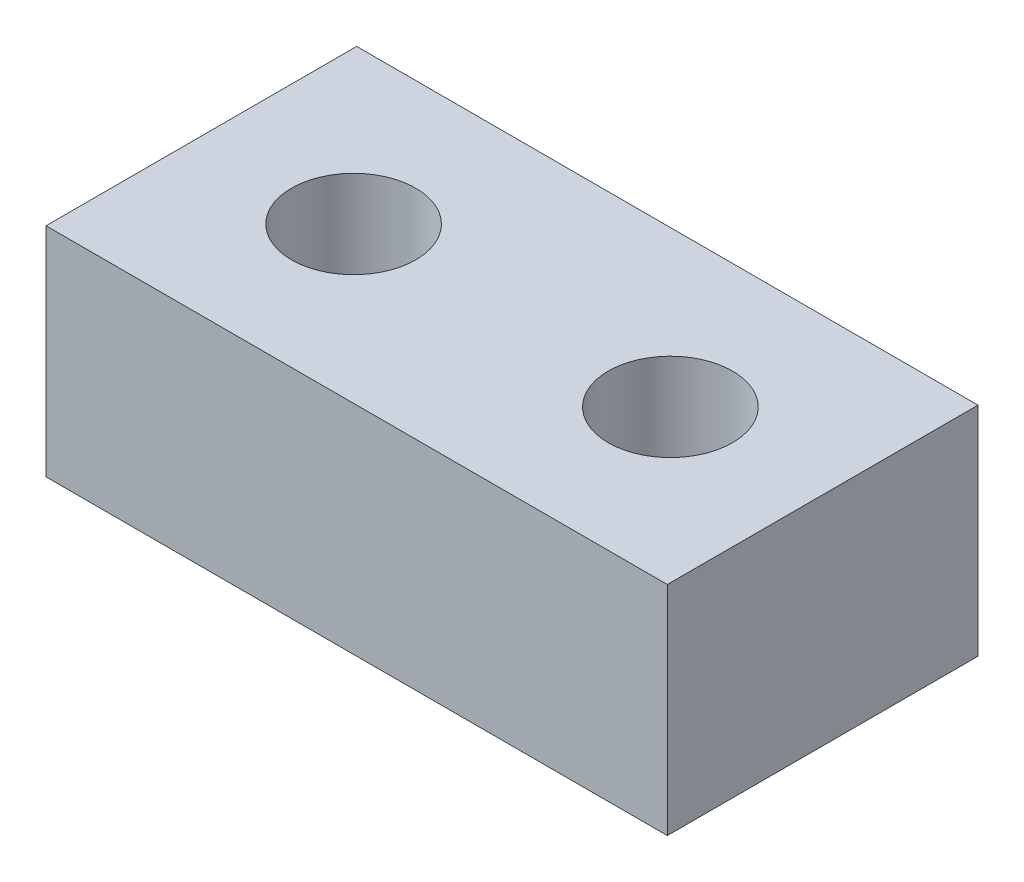
ISO-10303-21;
HEADER;
FILE_DESCRIPTION(('STEP AP214'),'2;1');
FILE_NAME('part.step','',(''),(''),'','','');
FILE_SCHEMA(('AUTOMOTIVE_DESIGN { 1 0 10303 214 1 1 1 1 }'));
ENDSEC;
DATA;
#1=APPLICATION_CONTEXT('core data for automotive mechanical design processes');
#2=APPLICATION_PROTOCOL_DEFINITION('international standard','automotive_design',2000,#1);
#3=PRODUCT_CONTEXT('',#1,'mechanical');
#4=PRODUCT('Part','Part','',(#3));
#5=PRODUCT_RELATED_PRODUCT_CATEGORY('part','',(#4));
#6=PRODUCT_DEFINITION_FORMATION('','',#4);
#7=PRODUCT_DEFINITION_CONTEXT('part definition',#1,'design');
#8=PRODUCT_DEFINITION('design','',#6,#7);
#9=PRODUCT_DEFINITION_SHAPE('','',#8);
#10=(LENGTH_UNIT() NAMED_UNIT(*) SI_UNIT(.MILLI.,.METRE.));
#11=(NAMED_UNIT(*) PLANE_ANGLE_UNIT() SI_UNIT($,.RADIAN.));
#12=(NAMED_UNIT(*) SI_UNIT($,.STERADIAN.) SOLID_ANGLE_UNIT());
#13=UNCERTAINTY_MEASURE_WITH_UNIT(LENGTH_MEASURE(1.E-05),#10,'distance_accuracy_value','');
#14=(GEOMETRIC_REPRESENTATION_CONTEXT(3) GLOBAL_UNCERTAINTY_ASSIGNED_CONTEXT((#13)) GLOBAL_UNIT_ASSIGNED_CONTEXT((#10,
#11,#12)) REPRESENTATION_CONTEXT('',''));
#15=CARTESIAN_POINT('',(0.,0.,0.));
#16=DIRECTION('',(0.,0.,1.));
#17=DIRECTION('',(1.,0.,0.));
#18=AXIS2_PLACEMENT_3D('',#15,#16,#17);
#19=CARTESIAN_POINT('',(0.,-70.,0.));
#20=DIRECTION('',(-1.,0.,0.));
#21=DIRECTION('',(0.,0.,1.));
#22=AXIS2_PLACEMENT_3D('',#19,#20,#21);
#23=PLANE('',#22);
#24=DIRECTION('',(0.,0.,1.));
#25=VECTOR('',#24,1.);
#26=CARTESIAN_POINT('',(0.,0.,0.));
#27=LINE('',#26,#25);
#28=CARTESIAN_POINT('',(0.,0.,-100.));
#29=VERTEX_POINT('',#28);
#30=CARTESIAN_POINT('',(0.,0.,0.));
#31=VERTEX_POINT('',#30);
#32=EDGE_CURVE('E98',#29,#31,#27,.T.);
#33=ORIENTED_EDGE('',*,*,#32,.F.);
#34=DIRECTION('',(0.,1.,0.));
#35=VECTOR('',#34,1.);
#36=CARTESIAN_POINT('',(0.,-70.,-100.));
#37=LINE('',#36,#35);
#38=CARTESIAN_POINT('',(0.,-70.,-100.));
#39=VERTEX_POINT('',#38);
#40=EDGE_CURVE('E11',#39,#29,#37,.T.);
#41=ORIENTED_EDGE('',*,*,#40,.F.);
#42=DIRECTION('',(0.,0.,1.));
#43=VECTOR('',#42,1.);
#44=CARTESIAN_POINT('',(0.,-70.,0.));
#45=LINE('',#44,#43);
#46=CARTESIAN_POINT('',(0.,-70.,0.));
#47=VERTEX_POINT('',#46);
#48=EDGE_CURVE('E91',#39,#47,#45,.T.);
#49=ORIENTED_EDGE('',*,*,#48,.T.);
#50=DIRECTION('',(0.,1.,0.));
#51=VECTOR('',#50,1.);
#52=CARTESIAN_POINT('',(0.,-70.,0.));
#53=LINE('',#52,#51);
#54=EDGE_CURVE('E36',#47,#31,#53,.T.);
#55=ORIENTED_EDGE('',*,*,#54,.T.);
#56=EDGE_LOOP('',(#33,#41,#49,#55));
#57=FACE_BOUND('',#56,.T.);
#58=ADVANCED_FACE('F33',(#57),#23,.T.);
#59=CARTESIAN_POINT('',(0.,-70.,-100.));
#60=DIRECTION('',(0.,0.,-1.));
#61=DIRECTION('',(-1.,0.,0.));
#62=AXIS2_PLACEMENT_3D('',#59,#60,#61);
#63=PLANE('',#62);
#64=DIRECTION('',(-1.,0.,0.));
#65=VECTOR('',#64,1.);
#66=CARTESIAN_POINT('',(0.,0.,-100.));
#67=LINE('',#66,#65);
#68=CARTESIAN_POINT('',(200.,0.,-100.));
#69=VERTEX_POINT('',#68);
#70=EDGE_CURVE('E93',#69,#29,#67,.T.);
#71=ORIENTED_EDGE('',*,*,#70,.F.);
#72=DIRECTION('',(0.,1.,0.));
#73=VECTOR('',#72,1.);
#74=CARTESIAN_POINT('',(200.,-70.,-100.));
#75=LINE('',#74,#73);
#76=CARTESIAN_POINT('',(200.,-70.,-100.));
#77=VERTEX_POINT('',#76);
#78=EDGE_CURVE('E42',#77,#69,#75,.T.);
#79=ORIENTED_EDGE('',*,*,#78,.F.);
#80=DIRECTION('',(-1.,0.,0.));
#81=VECTOR('',#80,1.);
#82=CARTESIAN_POINT('',(0.,-70.,-100.));
#83=LINE('',#82,#81);
#84=EDGE_CURVE('E88',#77,#39,#83,.T.);
#85=ORIENTED_EDGE('',*,*,#84,.T.);
#86=ORIENTED_EDGE('',*,*,#40,.T.);
#87=EDGE_LOOP('',(#71,#79,#85,#86));
#88=FACE_BOUND('',#87,.T.);
#89=ADVANCED_FACE('F109',(#88),#63,.T.);
#90=CARTESIAN_POINT('',(200.,-70.,0.));
#91=DIRECTION('',(1.,0.,0.));
#92=DIRECTION('',(0.,0.,-1.));
#93=AXIS2_PLACEMENT_3D('',#90,#91,#92);
#94=PLANE('',#93);
#95=DIRECTION('',(0.,0.,-1.));
#96=VECTOR('',#95,1.);
#97=CARTESIAN_POINT('',(200.,0.,0.));
#98=LINE('',#97,#96);
#99=CARTESIAN_POINT('',(200.,0.,0.));
#100=VERTEX_POINT('',#99);
#101=EDGE_CURVE('E83',#100,#69,#98,.T.);
#102=ORIENTED_EDGE('',*,*,#101,.F.);
#103=DIRECTION('',(0.,1.,0.));
#104=VECTOR('',#103,1.);
#105=CARTESIAN_POINT('',(200.,-70.,0.));
#106=LINE('',#105,#104);
#107=CARTESIAN_POINT('',(200.,-70.,0.));
#108=VERTEX_POINT('',#107);
#109=EDGE_CURVE('E78',#108,#100,#106,.T.);
#110=ORIENTED_EDGE('',*,*,#109,.F.);
#111=DIRECTION('',(0.,0.,-1.));
#112=VECTOR('',#111,1.);
#113=CARTESIAN_POINT('',(200.,-70.,0.));
#114=LINE('',#113,#112);
#115=EDGE_CURVE('E81',#108,#77,#114,.T.);
#116=ORIENTED_EDGE('',*,*,#115,.T.);
#117=ORIENTED_EDGE('',*,*,#78,.T.);
#118=EDGE_LOOP('',(#102,#110,#116,#117));
#119=FACE_BOUND('',#118,.T.);
#120=ADVANCED_FACE('F80',(#119),#94,.T.);
#121=CARTESIAN_POINT('',(0.,-70.,0.));
#122=DIRECTION('',(0.,0.,1.));
#123=DIRECTION('',(1.,0.,0.));
#124=AXIS2_PLACEMENT_3D('',#121,#122,#123);
#125=PLANE('',#124);
#126=DIRECTION('',(1.,0.,0.));
#127=VECTOR('',#126,1.);
#128=CARTESIAN_POINT('',(0.,0.,0.));
#129=LINE('',#128,#127);
#130=EDGE_CURVE('E101',#31,#100,#129,.T.);
#131=ORIENTED_EDGE('',*,*,#130,.F.);
#132=ORIENTED_EDGE('',*,*,#54,.F.);
#133=DIRECTION('',(1.,0.,0.));
#134=VECTOR('',#133,1.);
#135=CARTESIAN_POINT('',(0.,-70.,0.));
#136=LINE('',#135,#134);
#137=EDGE_CURVE('E87',#47,#108,#136,.T.);
#138=ORIENTED_EDGE('',*,*,#137,.T.);
#139=ORIENTED_EDGE('',*,*,#109,.T.);
#140=EDGE_LOOP('',(#131,#132,#138,#139));
#141=FACE_BOUND('',#140,.T.);
#142=ADVANCED_FACE('F90',(#141),#125,.T.);
#143=CARTESIAN_POINT('',(0.,-70.,0.));
#144=DIRECTION('',(0.,-1.,0.));
#145=DIRECTION('',(0.,0.,-1.));
#146=AXIS2_PLACEMENT_3D('',#143,#144,#145);
#147=PLANE('',#146);
#148=ORIENTED_EDGE('',*,*,#48,.F.);
#149=ORIENTED_EDGE('',*,*,#84,.F.);
#150=ORIENTED_EDGE('',*,*,#115,.F.);
#151=ORIENTED_EDGE('',*,*,#137,.F.);
#152=EDGE_LOOP('',(#148,#149,#150,#151));
#153=FACE_BOUND('',#152,.T.);
#154=ADVANCED_FACE('F86',(#153),#147,.T.);
#155=CARTESIAN_POINT('',(0.,0.,0.));
#156=DIRECTION('',(0.,-1.,0.));
#157=DIRECTION('',(0.,0.,-1.));
#158=AXIS2_PLACEMENT_3D('',#155,#156,#157);
#159=PLANE('',#158);
#160=CARTESIAN_POINT('',(150.982726136184,0.,-50.));
#161=DIRECTION('',(0.,1.,0.));
#162=DIRECTION('',(0.,0.,1.));
#163=AXIS2_PLACEMENT_3D('',#160,#161,#162);
#164=CIRCLE('',#163,20.);
#165=CARTESIAN_POINT('',(150.982726136184,0.,-30.));
#166=VERTEX_POINT('',#165);
#167=EDGE_CURVE('E150',#166,#166,#164,.T.);
#168=ORIENTED_EDGE('',*,*,#167,.F.);
#169=EDGE_LOOP('',(#168));
#170=FACE_BOUND('',#169,.T.);
#171=CARTESIAN_POINT('',(49.0172738638165,0.,-50.));
#172=DIRECTION('',(0.,1.,0.));
#173=DIRECTION('',(0.,0.,1.));
#174=AXIS2_PLACEMENT_3D('',#171,#172,#173);
#175=CIRCLE('',#174,20.);
#176=CARTESIAN_POINT('',(49.0172738638165,0.,-30.));
#177=VERTEX_POINT('',#176);
#178=EDGE_CURVE('E149',#177,#177,#175,.T.);
#179=ORIENTED_EDGE('',*,*,#178,.F.);
#180=EDGE_LOOP('',(#179));
#181=FACE_BOUND('',#180,.T.);
#182=ORIENTED_EDGE('',*,*,#32,.T.);
#183=ORIENTED_EDGE('',*,*,#130,.T.);
#184=ORIENTED_EDGE('',*,*,#101,.T.);
#185=ORIENTED_EDGE('',*,*,#70,.T.);
#186=EDGE_LOOP('',(#182,#183,#184,#185));
#187=FACE_BOUND('',#186,.T.);
#188=ADVANCED_FACE('F108',(#170,#181,#187),#159,.F.);
#189=CARTESIAN_POINT('',(49.0172738638165,-40.,-50.));
#190=DIRECTION('',(0.,1.,0.));
#191=DIRECTION('',(0.,0.,1.));
#192=AXIS2_PLACEMENT_3D('',#189,#190,#191);
#193=CYLINDRICAL_SURFACE('',#192,20.);
#194=CARTESIAN_POINT('',(49.0172738638165,-40.,-50.));
#195=DIRECTION('',(0.,1.,0.));
#196=DIRECTION('',(0.,0.,1.));
#197=AXIS2_PLACEMENT_3D('',#194,#195,#196);
#198=CIRCLE('',#197,20.);
#199=CARTESIAN_POINT('',(49.0172738638165,-40.,-30.));
#200=VERTEX_POINT('',#199);
#201=EDGE_CURVE('E102',#200,#200,#198,.T.);
#202=ORIENTED_EDGE('',*,*,#201,.F.);
#203=EDGE_LOOP('',(#202));
#204=FACE_BOUND('',#203,.T.);
#205=ORIENTED_EDGE('',*,*,#178,.T.);
#206=EDGE_LOOP('',(#205));
#207=FACE_BOUND('',#206,.T.);
#208=ADVANCED_FACE('F127',(#204,#207),#193,.F.);
#209=CARTESIAN_POINT('',(49.0172738638165,-40.,-50.));
#210=DIRECTION('',(0.,1.,0.));
#211=DIRECTION('',(0.,0.,1.));
#212=AXIS2_PLACEMENT_3D('',#209,#210,#211);
#213=PLANE('',#212);
#214=ORIENTED_EDGE('',*,*,#201,.T.);
#215=EDGE_LOOP('',(#214));
#216=FACE_BOUND('',#215,.T.);
#217=ADVANCED_FACE('F132',(#216),#213,.T.);
#218=CARTESIAN_POINT('',(150.982726136184,-40.,-50.));
#219=DIRECTION('',(0.,1.,0.));
#220=DIRECTION('',(0.,0.,1.));
#221=AXIS2_PLACEMENT_3D('',#218,#219,#220);
#222=CYLINDRICAL_SURFACE('',#221,20.);
#223=CARTESIAN_POINT('',(150.982726136184,-40.,-50.));
#224=DIRECTION('',(0.,1.,0.));
#225=DIRECTION('',(0.,0.,1.));
#226=AXIS2_PLACEMENT_3D('',#223,#224,#225);
#227=CIRCLE('',#226,20.);
#228=CARTESIAN_POINT('',(150.982726136184,-40.,-30.));
#229=VERTEX_POINT('',#228);
#230=EDGE_CURVE('E148',#229,#229,#227,.T.);
#231=ORIENTED_EDGE('',*,*,#230,.F.);
#232=EDGE_LOOP('',(#231));
#233=FACE_BOUND('',#232,.T.);
#234=ORIENTED_EDGE('',*,*,#167,.T.);
#235=EDGE_LOOP('',(#234));
#236=FACE_BOUND('',#235,.T.);
#237=ADVANCED_FACE('F136',(#233,#236),#222,.F.);
#238=CARTESIAN_POINT('',(0.,-40.,0.));
#239=DIRECTION('',(0.,1.,0.));
#240=DIRECTION('',(0.,0.,1.));
#241=AXIS2_PLACEMENT_3D('',#238,#239,#240);
#242=PLANE('',#241);
#243=ORIENTED_EDGE('',*,*,#230,.T.);
#244=EDGE_LOOP('',(#243));
#245=FACE_BOUND('',#244,.T.);
#246=ADVANCED_FACE('F140',(#245),#242,.T.);
#247=CLOSED_SHELL('',(#58,#89,#120,#142,#154,#188,#208,#217,#237,#246));
#248=MANIFOLD_SOLID_BREP('B2',#247);
#249=ADVANCED_BREP_SHAPE_REPRESENTATION('',(#18,#248),#14);
#250=SHAPE_DEFINITION_REPRESENTATION(#9,#249);
ENDSEC;
END-ISO-10303-21;
